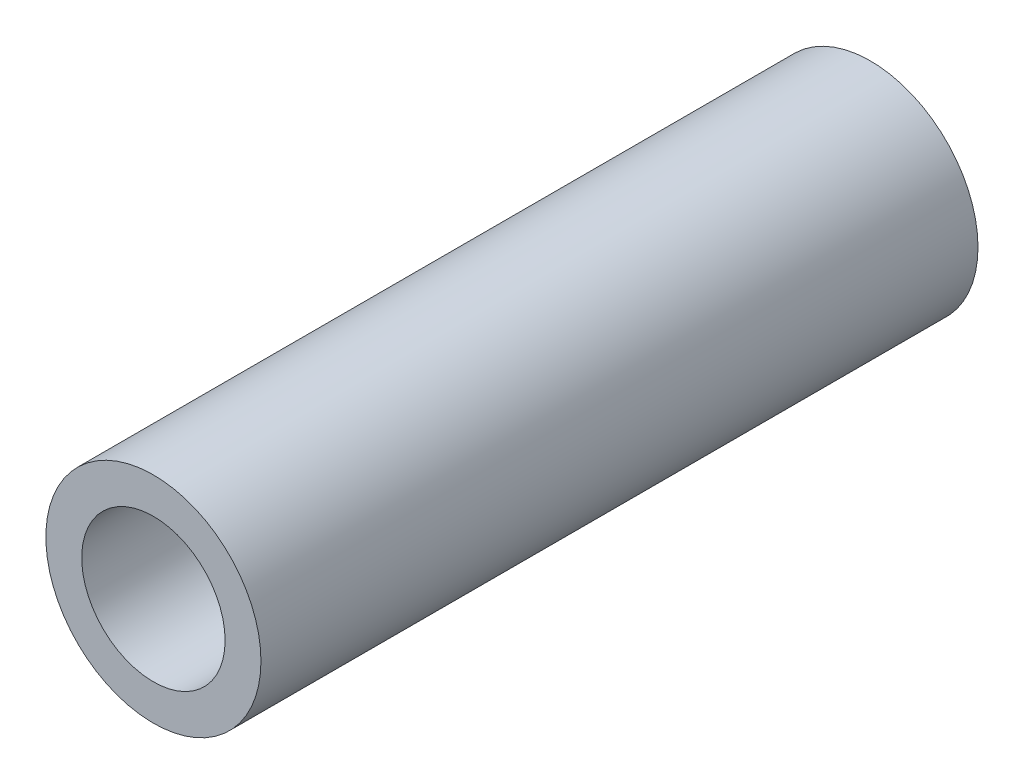
ISO-10303-21;
HEADER;
FILE_DESCRIPTION(('STEP AP214'),'2;1');
FILE_NAME('part.step','',(''),(''),'','','');
FILE_SCHEMA(('AUTOMOTIVE_DESIGN { 1 0 10303 214 1 1 1 1 }'));
ENDSEC;
DATA;
#1=APPLICATION_CONTEXT('core data for automotive mechanical design processes');
#2=APPLICATION_PROTOCOL_DEFINITION('international standard','automotive_design',2000,#1);
#3=PRODUCT_CONTEXT('',#1,'mechanical');
#4=PRODUCT('Part','Part','',(#3));
#5=PRODUCT_RELATED_PRODUCT_CATEGORY('part','',(#4));
#6=PRODUCT_DEFINITION_FORMATION('','',#4);
#7=PRODUCT_DEFINITION_CONTEXT('part definition',#1,'design');
#8=PRODUCT_DEFINITION('design','',#6,#7);
#9=PRODUCT_DEFINITION_SHAPE('','',#8);
#10=(LENGTH_UNIT() NAMED_UNIT(*) SI_UNIT(.MILLI.,.METRE.));
#11=(NAMED_UNIT(*) PLANE_ANGLE_UNIT() SI_UNIT($,.RADIAN.));
#12=(NAMED_UNIT(*) SI_UNIT($,.STERADIAN.) SOLID_ANGLE_UNIT());
#13=UNCERTAINTY_MEASURE_WITH_UNIT(LENGTH_MEASURE(1.E-05),#10,'distance_accuracy_value','');
#14=(GEOMETRIC_REPRESENTATION_CONTEXT(3) GLOBAL_UNCERTAINTY_ASSIGNED_CONTEXT((#13)) GLOBAL_UNIT_ASSIGNED_CONTEXT((#10,
#11,#12)) REPRESENTATION_CONTEXT('',''));
#15=CARTESIAN_POINT('',(0.,0.,0.));
#16=DIRECTION('',(0.,0.,1.));
#17=DIRECTION('',(1.,0.,0.));
#18=AXIS2_PLACEMENT_3D('',#15,#16,#17);
#19=CARTESIAN_POINT('',(0.,0.,20.));
#20=DIRECTION('',(0.,0.,1.));
#21=DIRECTION('',(1.,0.,0.));
#22=AXIS2_PLACEMENT_3D('',#19,#20,#21);
#23=PLANE('',#22);
#24=CARTESIAN_POINT('',(0.,0.,20.));
#25=DIRECTION('',(0.,0.,1.));
#26=DIRECTION('',(1.,0.,0.));
#27=AXIS2_PLACEMENT_3D('',#24,#25,#26);
#28=CIRCLE('',#27,3.);
#29=CARTESIAN_POINT('',(3.,0.,20.));
#30=VERTEX_POINT('',#29);
#31=EDGE_CURVE('E10',#30,#30,#28,.T.);
#32=ORIENTED_EDGE('',*,*,#31,.T.);
#33=EDGE_LOOP('',(#32));
#34=FACE_BOUND('',#33,.T.);
#35=CARTESIAN_POINT('',(0.,0.,20.));
#36=DIRECTION('',(0.,0.,1.));
#37=DIRECTION('',(1.,0.,0.));
#38=AXIS2_PLACEMENT_3D('',#35,#36,#37);
#39=CIRCLE('',#38,2.);
#40=CARTESIAN_POINT('',(2.,0.,20.));
#41=VERTEX_POINT('',#40);
#42=EDGE_CURVE('E46',#41,#41,#39,.T.);
#43=ORIENTED_EDGE('',*,*,#42,.F.);
#44=EDGE_LOOP('',(#43));
#45=FACE_BOUND('',#44,.T.);
#46=ADVANCED_FACE('F35',(#34,#45),#23,.T.);
#47=CARTESIAN_POINT('',(0.,0.,0.));
#48=DIRECTION('',(0.,0.,1.));
#49=DIRECTION('',(1.,0.,0.));
#50=AXIS2_PLACEMENT_3D('',#47,#48,#49);
#51=PLANE('',#50);
#52=CARTESIAN_POINT('',(0.,0.,0.));
#53=DIRECTION('',(0.,0.,1.));
#54=DIRECTION('',(1.,0.,0.));
#55=AXIS2_PLACEMENT_3D('',#52,#53,#54);
#56=CIRCLE('',#55,3.);
#57=CARTESIAN_POINT('',(3.,0.,0.));
#58=VERTEX_POINT('',#57);
#59=EDGE_CURVE('E39',#58,#58,#56,.T.);
#60=ORIENTED_EDGE('',*,*,#59,.F.);
#61=EDGE_LOOP('',(#60));
#62=FACE_BOUND('',#61,.T.);
#63=CARTESIAN_POINT('',(0.,0.,0.));
#64=DIRECTION('',(0.,0.,1.));
#65=DIRECTION('',(1.,0.,0.));
#66=AXIS2_PLACEMENT_3D('',#63,#64,#65);
#67=CIRCLE('',#66,2.);
#68=CARTESIAN_POINT('',(2.,0.,0.));
#69=VERTEX_POINT('',#68);
#70=EDGE_CURVE('E48',#69,#69,#67,.T.);
#71=ORIENTED_EDGE('',*,*,#70,.T.);
#72=EDGE_LOOP('',(#71));
#73=FACE_BOUND('',#72,.T.);
#74=ADVANCED_FACE('F58',(#62,#73),#51,.F.);
#75=CARTESIAN_POINT('',(0.,0.,20.));
#76=DIRECTION('',(0.,0.,-1.));
#77=DIRECTION('',(-1.,0.,0.));
#78=AXIS2_PLACEMENT_3D('',#75,#76,#77);
#79=CYLINDRICAL_SURFACE('',#78,3.);
#80=ORIENTED_EDGE('',*,*,#31,.F.);
#81=EDGE_LOOP('',(#80));
#82=FACE_BOUND('',#81,.T.);
#83=ORIENTED_EDGE('',*,*,#59,.T.);
#84=EDGE_LOOP('',(#83));
#85=FACE_BOUND('',#84,.T.);
#86=ADVANCED_FACE('F37',(#82,#85),#79,.T.);
#87=CARTESIAN_POINT('',(0.,0.,20.));
#88=DIRECTION('',(0.,0.,-1.));
#89=DIRECTION('',(-1.,0.,0.));
#90=AXIS2_PLACEMENT_3D('',#87,#88,#89);
#91=CYLINDRICAL_SURFACE('',#90,2.);
#92=ORIENTED_EDGE('',*,*,#42,.T.);
#93=EDGE_LOOP('',(#92));
#94=FACE_BOUND('',#93,.T.);
#95=ORIENTED_EDGE('',*,*,#70,.F.);
#96=EDGE_LOOP('',(#95));
#97=FACE_BOUND('',#96,.T.);
#98=ADVANCED_FACE('F54',(#94,#97),#91,.F.);
#99=CLOSED_SHELL('',(#46,#74,#86,#98));
#100=MANIFOLD_SOLID_BREP('B2',#99);
#101=ADVANCED_BREP_SHAPE_REPRESENTATION('',(#18,#100),#14);
#102=SHAPE_DEFINITION_REPRESENTATION(#9,#101);
ENDSEC;
END-ISO-10303-21;
